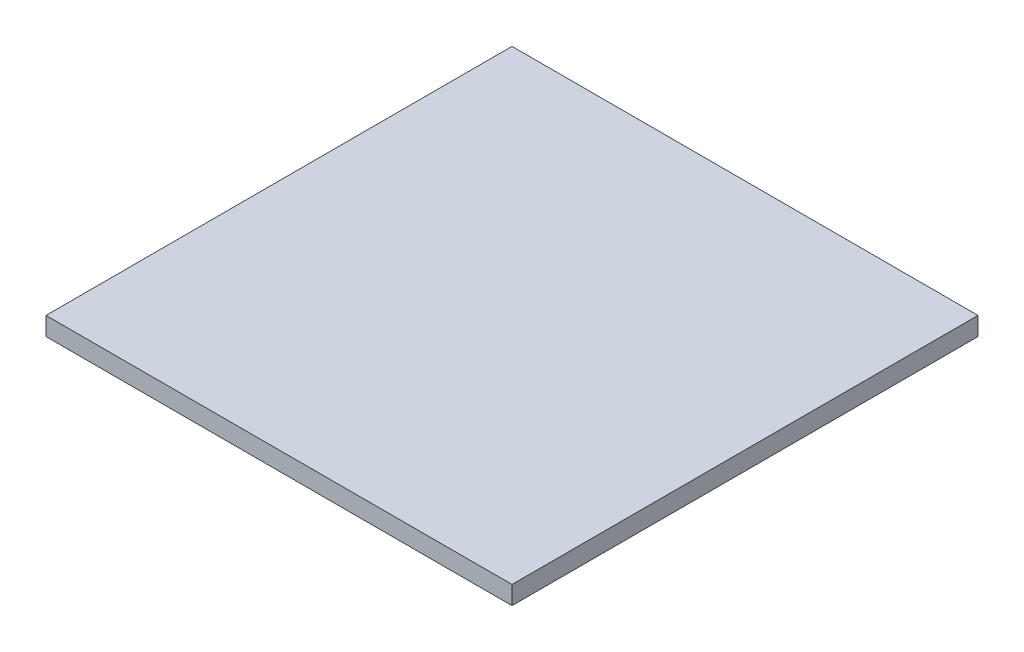
ISO-10303-21;
HEADER;
FILE_DESCRIPTION(('STEP AP214'),'2;1');
FILE_NAME('part.step','',(''),(''),'','','');
FILE_SCHEMA(('AUTOMOTIVE_DESIGN { 1 0 10303 214 1 1 1 1 }'));
ENDSEC;
DATA;
#1=APPLICATION_CONTEXT('core data for automotive mechanical design processes');
#2=APPLICATION_PROTOCOL_DEFINITION('international standard','automotive_design',2000,#1);
#3=PRODUCT_CONTEXT('',#1,'mechanical');
#4=PRODUCT('Part','Part','',(#3));
#5=PRODUCT_RELATED_PRODUCT_CATEGORY('part','',(#4));
#6=PRODUCT_DEFINITION_FORMATION('','',#4);
#7=PRODUCT_DEFINITION_CONTEXT('part definition',#1,'design');
#8=PRODUCT_DEFINITION('design','',#6,#7);
#9=PRODUCT_DEFINITION_SHAPE('','',#8);
#10=(LENGTH_UNIT() NAMED_UNIT(*) SI_UNIT(.MILLI.,.METRE.));
#11=(NAMED_UNIT(*) PLANE_ANGLE_UNIT() SI_UNIT($,.RADIAN.));
#12=(NAMED_UNIT(*) SI_UNIT($,.STERADIAN.) SOLID_ANGLE_UNIT());
#13=UNCERTAINTY_MEASURE_WITH_UNIT(LENGTH_MEASURE(1.E-05),#10,'distance_accuracy_value','');
#14=(GEOMETRIC_REPRESENTATION_CONTEXT(3) GLOBAL_UNCERTAINTY_ASSIGNED_CONTEXT((#13)) GLOBAL_UNIT_ASSIGNED_CONTEXT((#10,
#11,#12)) REPRESENTATION_CONTEXT('',''));
#15=CARTESIAN_POINT('',(0.,0.,0.));
#16=DIRECTION('',(0.,0.,1.));
#17=DIRECTION('',(1.,0.,0.));
#18=AXIS2_PLACEMENT_3D('',#15,#16,#17);
#19=CARTESIAN_POINT('',(127.,6.35,127.));
#20=DIRECTION('',(1.,0.,0.));
#21=DIRECTION('',(0.,0.,-1.));
#22=AXIS2_PLACEMENT_3D('',#19,#20,#21);
#23=PLANE('',#22);
#24=DIRECTION('',(0.,1.,0.));
#25=VECTOR('',#24,1.);
#26=CARTESIAN_POINT('',(127.,6.35,127.));
#27=LINE('',#26,#25);
#28=CARTESIAN_POINT('',(127.,-3.65,127.));
#29=VERTEX_POINT('',#28);
#30=CARTESIAN_POINT('',(127.,6.35,127.));
#31=VERTEX_POINT('',#30);
#32=EDGE_CURVE('E11',#29,#31,#27,.T.);
#33=ORIENTED_EDGE('',*,*,#32,.F.);
#34=DIRECTION('',(0.,0.,1.));
#35=VECTOR('',#34,1.);
#36=CARTESIAN_POINT('',(127.,-3.65,0.));
#37=LINE('',#36,#35);
#38=CARTESIAN_POINT('',(127.,-3.65,-127.));
#39=VERTEX_POINT('',#38);
#40=EDGE_CURVE('E89',#29,#39,#37,.F.);
#41=ORIENTED_EDGE('',*,*,#40,.T.);
#42=DIRECTION('',(0.,1.,0.));
#43=VECTOR('',#42,1.);
#44=CARTESIAN_POINT('',(127.,6.35,-127.));
#45=LINE('',#44,#43);
#46=CARTESIAN_POINT('',(127.,6.35,-127.));
#47=VERTEX_POINT('',#46);
#48=EDGE_CURVE('E45',#39,#47,#45,.T.);
#49=ORIENTED_EDGE('',*,*,#48,.T.);
#50=DIRECTION('',(0.,0.,-1.));
#51=VECTOR('',#50,1.);
#52=CARTESIAN_POINT('',(127.,6.35,127.));
#53=LINE('',#52,#51);
#54=EDGE_CURVE('E102',#31,#47,#53,.T.);
#55=ORIENTED_EDGE('',*,*,#54,.F.);
#56=EDGE_LOOP('',(#33,#41,#49,#55));
#57=FACE_BOUND('',#56,.T.);
#58=ADVANCED_FACE('F35',(#57),#23,.T.);
#59=CARTESIAN_POINT('',(127.,6.35,-127.));
#60=DIRECTION('',(0.,0.,-1.));
#61=DIRECTION('',(-1.,0.,0.));
#62=AXIS2_PLACEMENT_3D('',#59,#60,#61);
#63=PLANE('',#62);
#64=ORIENTED_EDGE('',*,*,#48,.F.);
#65=DIRECTION('',(1.,0.,0.));
#66=VECTOR('',#65,1.);
#67=CARTESIAN_POINT('',(0.,-3.65,-127.));
#68=LINE('',#67,#66);
#69=CARTESIAN_POINT('',(-127.,-3.65,-127.));
#70=VERTEX_POINT('',#69);
#71=EDGE_CURVE('E96',#39,#70,#68,.F.);
#72=ORIENTED_EDGE('',*,*,#71,.T.);
#73=DIRECTION('',(0.,1.,0.));
#74=VECTOR('',#73,1.);
#75=CARTESIAN_POINT('',(-127.,6.35,-127.));
#76=LINE('',#75,#74);
#77=CARTESIAN_POINT('',(-127.,6.35,-127.));
#78=VERTEX_POINT('',#77);
#79=EDGE_CURVE('E53',#70,#78,#76,.T.);
#80=ORIENTED_EDGE('',*,*,#79,.T.);
#81=DIRECTION('',(-1.,0.,0.));
#82=VECTOR('',#81,1.);
#83=CARTESIAN_POINT('',(127.,6.35,-127.));
#84=LINE('',#83,#82);
#85=EDGE_CURVE('E83',#47,#78,#84,.T.);
#86=ORIENTED_EDGE('',*,*,#85,.F.);
#87=EDGE_LOOP('',(#64,#72,#80,#86));
#88=FACE_BOUND('',#87,.T.);
#89=ADVANCED_FACE('F106',(#88),#63,.T.);
#90=CARTESIAN_POINT('',(-127.,6.35,127.));
#91=DIRECTION('',(-1.,0.,0.));
#92=DIRECTION('',(0.,0.,1.));
#93=AXIS2_PLACEMENT_3D('',#90,#91,#92);
#94=PLANE('',#93);
#95=ORIENTED_EDGE('',*,*,#79,.F.);
#96=DIRECTION('',(0.,0.,1.));
#97=VECTOR('',#96,1.);
#98=CARTESIAN_POINT('',(-127.,-3.65,0.));
#99=LINE('',#98,#97);
#100=CARTESIAN_POINT('',(-127.,-3.65,127.));
#101=VERTEX_POINT('',#100);
#102=EDGE_CURVE('E88',#70,#101,#99,.T.);
#103=ORIENTED_EDGE('',*,*,#102,.T.);
#104=DIRECTION('',(0.,1.,0.));
#105=VECTOR('',#104,1.);
#106=CARTESIAN_POINT('',(-127.,6.35,127.));
#107=LINE('',#106,#105);
#108=CARTESIAN_POINT('',(-127.,6.35,127.));
#109=VERTEX_POINT('',#108);
#110=EDGE_CURVE('E39',#101,#109,#107,.T.);
#111=ORIENTED_EDGE('',*,*,#110,.T.);
#112=DIRECTION('',(0.,0.,1.));
#113=VECTOR('',#112,1.);
#114=CARTESIAN_POINT('',(-127.,6.35,127.));
#115=LINE('',#114,#113);
#116=EDGE_CURVE('E98',#78,#109,#115,.T.);
#117=ORIENTED_EDGE('',*,*,#116,.F.);
#118=EDGE_LOOP('',(#95,#103,#111,#117));
#119=FACE_BOUND('',#118,.T.);
#120=ADVANCED_FACE('F91',(#119),#94,.T.);
#121=CARTESIAN_POINT('',(127.,6.35,127.));
#122=DIRECTION('',(0.,0.,1.));
#123=DIRECTION('',(1.,0.,0.));
#124=AXIS2_PLACEMENT_3D('',#121,#122,#123);
#125=PLANE('',#124);
#126=DIRECTION('',(1.,0.,0.));
#127=VECTOR('',#126,1.);
#128=CARTESIAN_POINT('',(0.,-3.65,127.));
#129=LINE('',#128,#127);
#130=EDGE_CURVE('E77',#101,#29,#129,.T.);
#131=ORIENTED_EDGE('',*,*,#130,.T.);
#132=ORIENTED_EDGE('',*,*,#32,.T.);
#133=DIRECTION('',(1.,0.,0.));
#134=VECTOR('',#133,1.);
#135=CARTESIAN_POINT('',(127.,6.35,127.));
#136=LINE('',#135,#134);
#137=EDGE_CURVE('E79',#109,#31,#136,.T.);
#138=ORIENTED_EDGE('',*,*,#137,.F.);
#139=ORIENTED_EDGE('',*,*,#110,.F.);
#140=EDGE_LOOP('',(#131,#132,#138,#139));
#141=FACE_BOUND('',#140,.T.);
#142=ADVANCED_FACE('F37',(#141),#125,.T.);
#143=CARTESIAN_POINT('',(0.,6.35,0.));
#144=DIRECTION('',(0.,1.,0.));
#145=DIRECTION('',(0.,0.,1.));
#146=AXIS2_PLACEMENT_3D('',#143,#144,#145);
#147=PLANE('',#146);
#148=ORIENTED_EDGE('',*,*,#116,.T.);
#149=ORIENTED_EDGE('',*,*,#137,.T.);
#150=ORIENTED_EDGE('',*,*,#54,.T.);
#151=ORIENTED_EDGE('',*,*,#85,.T.);
#152=EDGE_LOOP('',(#148,#149,#150,#151));
#153=FACE_BOUND('',#152,.T.);
#154=ADVANCED_FACE('F105',(#153),#147,.T.);
#155=CARTESIAN_POINT('',(0.,-3.65,0.));
#156=DIRECTION('',(0.,1.,0.));
#157=DIRECTION('',(0.,0.,1.));
#158=AXIS2_PLACEMENT_3D('',#155,#156,#157);
#159=PLANE('',#158);
#160=ORIENTED_EDGE('',*,*,#102,.F.);
#161=ORIENTED_EDGE('',*,*,#71,.F.);
#162=ORIENTED_EDGE('',*,*,#40,.F.);
#163=ORIENTED_EDGE('',*,*,#130,.F.);
#164=EDGE_LOOP('',(#160,#161,#162,#163));
#165=FACE_BOUND('',#164,.T.);
#166=ADVANCED_FACE('F86',(#165),#159,.F.);
#167=CLOSED_SHELL('',(#58,#89,#120,#142,#154,#166));
#168=MANIFOLD_SOLID_BREP('B2',#167);
#169=ADVANCED_BREP_SHAPE_REPRESENTATION('',(#18,#168),#14);
#170=SHAPE_DEFINITION_REPRESENTATION(#9,#169);
ENDSEC;
END-ISO-10303-21;
